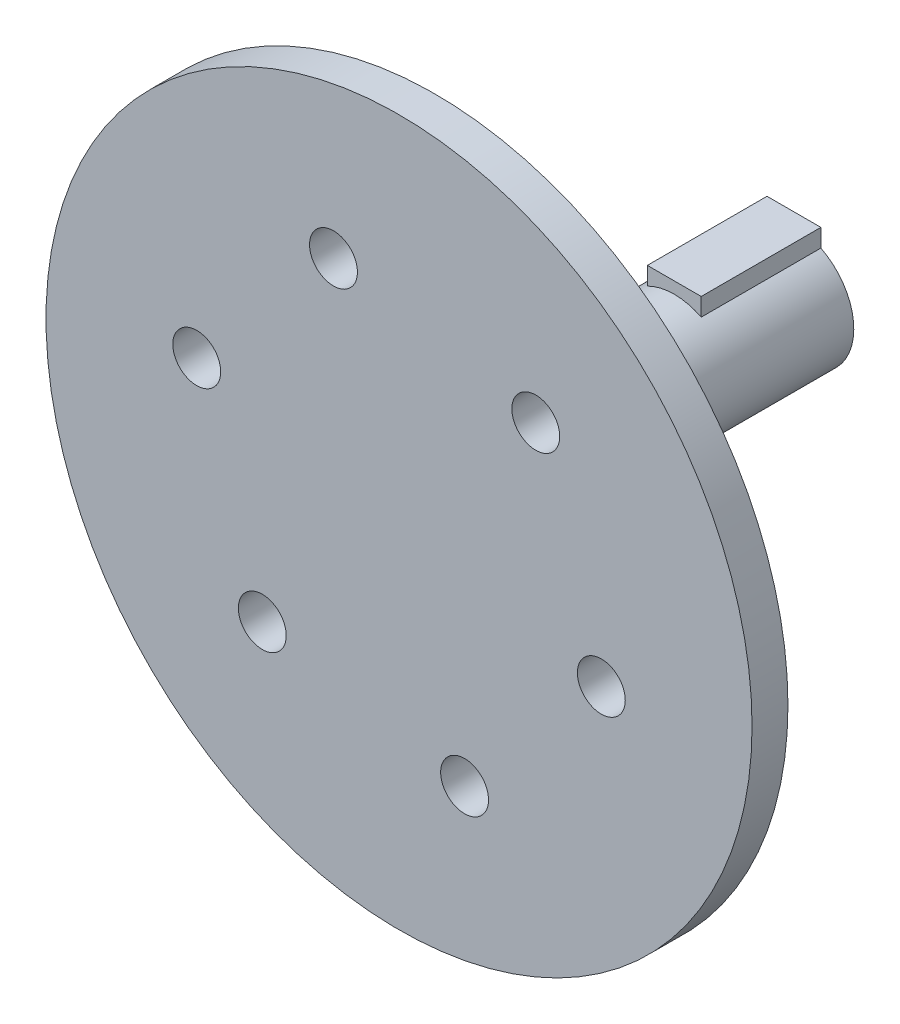
ISO-10303-21;
HEADER;
FILE_DESCRIPTION(('STEP AP214'),'2;1');
FILE_NAME('part.step','',(''),(''),'','','');
FILE_SCHEMA(('AUTOMOTIVE_DESIGN { 1 0 10303 214 1 1 1 1 }'));
ENDSEC;
DATA;
#1=APPLICATION_CONTEXT('core data for automotive mechanical design processes');
#2=APPLICATION_PROTOCOL_DEFINITION('international standard','automotive_design',2000,#1);
#3=PRODUCT_CONTEXT('',#1,'mechanical');
#4=PRODUCT('Part','Part','',(#3));
#5=PRODUCT_RELATED_PRODUCT_CATEGORY('part','',(#4));
#6=PRODUCT_DEFINITION_FORMATION('','',#4);
#7=PRODUCT_DEFINITION_CONTEXT('part definition',#1,'design');
#8=PRODUCT_DEFINITION('design','',#6,#7);
#9=PRODUCT_DEFINITION_SHAPE('','',#8);
#10=(LENGTH_UNIT() NAMED_UNIT(*) SI_UNIT(.MILLI.,.METRE.));
#11=(NAMED_UNIT(*) PLANE_ANGLE_UNIT() SI_UNIT($,.RADIAN.));
#12=(NAMED_UNIT(*) SI_UNIT($,.STERADIAN.) SOLID_ANGLE_UNIT());
#13=UNCERTAINTY_MEASURE_WITH_UNIT(LENGTH_MEASURE(1.E-05),#10,'distance_accuracy_value','');
#14=(GEOMETRIC_REPRESENTATION_CONTEXT(3) GLOBAL_UNCERTAINTY_ASSIGNED_CONTEXT((#13)) GLOBAL_UNIT_ASSIGNED_CONTEXT((#10,
#11,#12)) REPRESENTATION_CONTEXT('',''));
#15=CARTESIAN_POINT('',(0.,0.,0.));
#16=DIRECTION('',(0.,0.,1.));
#17=DIRECTION('',(1.,0.,0.));
#18=AXIS2_PLACEMENT_3D('',#15,#16,#17);
#19=CARTESIAN_POINT('',(0.,0.,10.));
#20=DIRECTION('',(0.,0.,1.));
#21=DIRECTION('',(1.,0.,0.));
#22=AXIS2_PLACEMENT_3D('',#19,#20,#21);
#23=PLANE('',#22);
#24=DIRECTION('',(0.,-1.,0.));
#25=VECTOR('',#24,1.);
#26=CARTESIAN_POINT('',(-2.25,0.,10.));
#27=LINE('',#26,#25);
#28=CARTESIAN_POINT('',(-2.25,5.96514277487294,10.));
#29=VERTEX_POINT('',#28);
#30=CARTESIAN_POINT('',(-2.25,4.46514277487294,10.));
#31=VERTEX_POINT('',#30);
#32=EDGE_CURVE('E58',#29,#31,#27,.T.);
#33=ORIENTED_EDGE('',*,*,#32,.T.);
#34=CARTESIAN_POINT('',(0.,0.,10.));
#35=DIRECTION('',(0.,0.,1.));
#36=DIRECTION('',(1.,0.,0.));
#37=AXIS2_PLACEMENT_3D('',#34,#35,#36);
#38=CIRCLE('',#37,5.);
#39=CARTESIAN_POINT('',(2.25,4.46514277487294,10.));
#40=VERTEX_POINT('',#39);
#41=EDGE_CURVE('E94',#31,#40,#38,.F.);
#42=ORIENTED_EDGE('',*,*,#41,.T.);
#43=DIRECTION('',(0.,-1.,0.));
#44=VECTOR('',#43,1.);
#45=CARTESIAN_POINT('',(2.25,0.,10.));
#46=LINE('',#45,#44);
#47=CARTESIAN_POINT('',(2.25,5.96514277487294,10.));
#48=VERTEX_POINT('',#47);
#49=EDGE_CURVE('E84',#48,#40,#46,.T.);
#50=ORIENTED_EDGE('',*,*,#49,.F.);
#51=DIRECTION('',(1.,0.,0.));
#52=VECTOR('',#51,1.);
#53=CARTESIAN_POINT('',(0.,5.96514277487294,10.));
#54=LINE('',#53,#52);
#55=EDGE_CURVE('E89',#29,#48,#54,.T.);
#56=ORIENTED_EDGE('',*,*,#55,.F.);
#57=EDGE_LOOP('',(#33,#42,#50,#56));
#58=FACE_BOUND('',#57,.T.);
#59=ADVANCED_FACE('F41',(#58),#23,.T.);
#60=CARTESIAN_POINT('',(0.,0.,10.));
#61=DIRECTION('',(0.,0.,-1.));
#62=DIRECTION('',(-1.,0.,0.));
#63=AXIS2_PLACEMENT_3D('',#60,#61,#62);
#64=CYLINDRICAL_SURFACE('',#63,5.);
#65=CARTESIAN_POINT('',(0.,0.,0.));
#66=DIRECTION('',(0.,0.,1.));
#67=DIRECTION('',(1.,0.,0.));
#68=AXIS2_PLACEMENT_3D('',#65,#66,#67);
#69=CIRCLE('',#68,5.);
#70=CARTESIAN_POINT('',(-2.25,4.46514277487294,0.));
#71=VERTEX_POINT('',#70);
#72=CARTESIAN_POINT('',(2.25,4.46514277487294,0.));
#73=VERTEX_POINT('',#72);
#74=EDGE_CURVE('E96',#71,#73,#69,.T.);
#75=ORIENTED_EDGE('',*,*,#74,.T.);
#76=DIRECTION('',(0.,0.,-1.));
#77=VECTOR('',#76,1.);
#78=CARTESIAN_POINT('',(2.25,4.46514277487294,10.));
#79=LINE('',#78,#77);
#80=EDGE_CURVE('E11',#40,#73,#79,.T.);
#81=ORIENTED_EDGE('',*,*,#80,.F.);
#82=ORIENTED_EDGE('',*,*,#41,.F.);
#83=DIRECTION('',(0.,0.,-1.));
#84=VECTOR('',#83,1.);
#85=CARTESIAN_POINT('',(-2.25,4.46514277487294,10.));
#86=LINE('',#85,#84);
#87=EDGE_CURVE('E108',#31,#71,#86,.T.);
#88=ORIENTED_EDGE('',*,*,#87,.T.);
#89=EDGE_LOOP('',(#75,#81,#82,#88));
#90=FACE_BOUND('',#89,.T.);
#91=CARTESIAN_POINT('',(0.,0.,30.));
#92=DIRECTION('',(0.,0.,1.));
#93=DIRECTION('',(1.,0.,0.));
#94=AXIS2_PLACEMENT_3D('',#91,#92,#93);
#95=CIRCLE('',#94,5.);
#96=CARTESIAN_POINT('',(5.,0.,30.));
#97=VERTEX_POINT('',#96);
#98=EDGE_CURVE('E98',#97,#97,#95,.T.);
#99=ORIENTED_EDGE('',*,*,#98,.F.);
#100=EDGE_LOOP('',(#99));
#101=FACE_BOUND('',#100,.T.);
#102=ADVANCED_FACE('F43',(#90,#101),#64,.T.);
#103=CARTESIAN_POINT('',(2.25,0.,10.));
#104=DIRECTION('',(1.,0.,0.));
#105=DIRECTION('',(0.,0.,-1.));
#106=AXIS2_PLACEMENT_3D('',#103,#104,#105);
#107=PLANE('',#106);
#108=DIRECTION('',(0.,-1.,0.));
#109=VECTOR('',#108,1.);
#110=CARTESIAN_POINT('',(2.25,0.,0.));
#111=LINE('',#110,#109);
#112=CARTESIAN_POINT('',(2.25,5.96514277487294,0.));
#113=VERTEX_POINT('',#112);
#114=EDGE_CURVE('E100',#113,#73,#111,.T.);
#115=ORIENTED_EDGE('',*,*,#114,.F.);
#116=DIRECTION('',(0.,0.,-1.));
#117=VECTOR('',#116,1.);
#118=CARTESIAN_POINT('',(2.25,5.96514277487294,10.));
#119=LINE('',#118,#117);
#120=EDGE_CURVE('E50',#48,#113,#119,.T.);
#121=ORIENTED_EDGE('',*,*,#120,.F.);
#122=ORIENTED_EDGE('',*,*,#49,.T.);
#123=ORIENTED_EDGE('',*,*,#80,.T.);
#124=EDGE_LOOP('',(#115,#121,#122,#123));
#125=FACE_BOUND('',#124,.T.);
#126=ADVANCED_FACE('F86',(#125),#107,.T.);
#127=CARTESIAN_POINT('',(0.,5.96514277487294,10.));
#128=DIRECTION('',(0.,1.,0.));
#129=DIRECTION('',(0.,0.,1.));
#130=AXIS2_PLACEMENT_3D('',#127,#128,#129);
#131=PLANE('',#130);
#132=DIRECTION('',(1.,0.,0.));
#133=VECTOR('',#132,1.);
#134=CARTESIAN_POINT('',(0.,5.96514277487294,0.));
#135=LINE('',#134,#133);
#136=CARTESIAN_POINT('',(-2.25,5.96514277487294,0.));
#137=VERTEX_POINT('',#136);
#138=EDGE_CURVE('E111',#137,#113,#135,.T.);
#139=ORIENTED_EDGE('',*,*,#138,.F.);
#140=DIRECTION('',(0.,0.,-1.));
#141=VECTOR('',#140,1.);
#142=CARTESIAN_POINT('',(-2.25,5.96514277487294,10.));
#143=LINE('',#142,#141);
#144=EDGE_CURVE('E74',#29,#137,#143,.T.);
#145=ORIENTED_EDGE('',*,*,#144,.F.);
#146=ORIENTED_EDGE('',*,*,#55,.T.);
#147=ORIENTED_EDGE('',*,*,#120,.T.);
#148=EDGE_LOOP('',(#139,#145,#146,#147));
#149=FACE_BOUND('',#148,.T.);
#150=ADVANCED_FACE('F118',(#149),#131,.T.);
#151=CARTESIAN_POINT('',(-2.25,0.,10.));
#152=DIRECTION('',(1.,0.,0.));
#153=DIRECTION('',(0.,1.,0.));
#154=AXIS2_PLACEMENT_3D('',#151,#152,#153);
#155=PLANE('',#154);
#156=DIRECTION('',(0.,-1.,0.));
#157=VECTOR('',#156,1.);
#158=CARTESIAN_POINT('',(-2.25,0.,0.));
#159=LINE('',#158,#157);
#160=EDGE_CURVE('E76',#137,#71,#159,.T.);
#161=ORIENTED_EDGE('',*,*,#160,.T.);
#162=ORIENTED_EDGE('',*,*,#87,.F.);
#163=ORIENTED_EDGE('',*,*,#32,.F.);
#164=ORIENTED_EDGE('',*,*,#144,.T.);
#165=EDGE_LOOP('',(#161,#162,#163,#164));
#166=FACE_BOUND('',#165,.T.);
#167=ADVANCED_FACE('F123',(#166),#155,.F.);
#168=CARTESIAN_POINT('',(0.,0.,0.));
#169=DIRECTION('',(0.,0.,1.));
#170=DIRECTION('',(1.,0.,0.));
#171=AXIS2_PLACEMENT_3D('',#168,#169,#170);
#172=PLANE('',#171);
#173=ORIENTED_EDGE('',*,*,#74,.F.);
#174=ORIENTED_EDGE('',*,*,#160,.F.);
#175=ORIENTED_EDGE('',*,*,#138,.T.);
#176=ORIENTED_EDGE('',*,*,#114,.T.);
#177=EDGE_LOOP('',(#173,#174,#175,#176));
#178=FACE_BOUND('',#177,.T.);
#179=ADVANCED_FACE('F120',(#178),#172,.F.);
#180=CARTESIAN_POINT('',(0.,0.,33.));
#181=DIRECTION('',(0.,0.,-1.));
#182=DIRECTION('',(-1.,0.,0.));
#183=AXIS2_PLACEMENT_3D('',#180,#181,#182);
#184=CYLINDRICAL_SURFACE('',#183,29.5);
#185=CARTESIAN_POINT('',(0.,0.,33.));
#186=DIRECTION('',(0.,0.,1.));
#187=DIRECTION('',(1.,0.,0.));
#188=AXIS2_PLACEMENT_3D('',#185,#186,#187);
#189=CIRCLE('',#188,29.5);
#190=CARTESIAN_POINT('',(29.5,0.,33.));
#191=VERTEX_POINT('',#190);
#192=EDGE_CURVE('E103',#191,#191,#189,.T.);
#193=ORIENTED_EDGE('',*,*,#192,.F.);
#194=EDGE_LOOP('',(#193));
#195=FACE_BOUND('',#194,.T.);
#196=CARTESIAN_POINT('',(0.,0.,30.));
#197=DIRECTION('',(0.,0.,1.));
#198=DIRECTION('',(1.,0.,0.));
#199=AXIS2_PLACEMENT_3D('',#196,#197,#198);
#200=CIRCLE('',#199,29.5);
#201=CARTESIAN_POINT('',(29.5,0.,30.));
#202=VERTEX_POINT('',#201);
#203=EDGE_CURVE('E212',#202,#202,#200,.T.);
#204=ORIENTED_EDGE('',*,*,#203,.T.);
#205=EDGE_LOOP('',(#204));
#206=FACE_BOUND('',#205,.T.);
#207=ADVANCED_FACE('F122',(#195,#206),#184,.T.);
#208=CARTESIAN_POINT('',(0.,0.,33.));
#209=DIRECTION('',(0.,0.,1.));
#210=DIRECTION('',(1.,0.,0.));
#211=AXIS2_PLACEMENT_3D('',#208,#209,#210);
#212=PLANE('',#211);
#213=CARTESIAN_POINT('',(-16.9046374461334,3.43449163847944,33.));
#214=DIRECTION('',(0.,0.,1.));
#215=DIRECTION('',(1.,0.,0.));
#216=AXIS2_PLACEMENT_3D('',#213,#214,#215);
#217=CIRCLE('',#216,2.);
#218=CARTESIAN_POINT('',(-14.9046374461334,3.43449163847944,33.));
#219=VERTEX_POINT('',#218);
#220=EDGE_CURVE('E205',#219,#219,#217,.T.);
#221=ORIENTED_EDGE('',*,*,#220,.F.);
#222=EDGE_LOOP('',(#221));
#223=FACE_BOUND('',#222,.T.);
#224=CARTESIAN_POINT('',(-11.4266757310751,-12.9225996508775,33.));
#225=DIRECTION('',(0.,0.,1.));
#226=DIRECTION('',(1.,0.,0.));
#227=AXIS2_PLACEMENT_3D('',#224,#225,#226);
#228=CIRCLE('',#227,2.);
#229=CARTESIAN_POINT('',(-9.4266757310751,-12.9225996508775,33.));
#230=VERTEX_POINT('',#229);
#231=EDGE_CURVE('E199',#230,#230,#228,.T.);
#232=ORIENTED_EDGE('',*,*,#231,.F.);
#233=EDGE_LOOP('',(#232));
#234=FACE_BOUND('',#233,.T.);
#235=CARTESIAN_POINT('',(5.47796171505833,-16.3570912893569,33.));
#236=DIRECTION('',(0.,0.,1.));
#237=DIRECTION('',(1.,0.,0.));
#238=AXIS2_PLACEMENT_3D('',#235,#236,#237);
#239=CIRCLE('',#238,2.);
#240=CARTESIAN_POINT('',(7.47796171505833,-16.3570912893569,33.));
#241=VERTEX_POINT('',#240);
#242=EDGE_CURVE('E193',#241,#241,#239,.T.);
#243=ORIENTED_EDGE('',*,*,#242,.F.);
#244=EDGE_LOOP('',(#243));
#245=FACE_BOUND('',#244,.T.);
#246=CARTESIAN_POINT('',(16.9046374461334,-3.43449163847932,33.));
#247=DIRECTION('',(0.,0.,1.));
#248=DIRECTION('',(1.,0.,0.));
#249=AXIS2_PLACEMENT_3D('',#246,#247,#248);
#250=CIRCLE('',#249,2.);
#251=CARTESIAN_POINT('',(18.9046374461334,-3.43449163847932,33.));
#252=VERTEX_POINT('',#251);
#253=EDGE_CURVE('E185',#252,#252,#250,.T.);
#254=ORIENTED_EDGE('',*,*,#253,.F.);
#255=EDGE_LOOP('',(#254));
#256=FACE_BOUND('',#255,.T.);
#257=CARTESIAN_POINT('',(11.426675731075,12.9225996508776,33.));
#258=DIRECTION('',(0.,0.,1.));
#259=DIRECTION('',(1.,0.,0.));
#260=AXIS2_PLACEMENT_3D('',#257,#258,#259);
#261=CIRCLE('',#260,2.);
#262=CARTESIAN_POINT('',(13.426675731075,12.9225996508776,33.));
#263=VERTEX_POINT('',#262);
#264=EDGE_CURVE('E178',#263,#263,#261,.T.);
#265=ORIENTED_EDGE('',*,*,#264,.F.);
#266=EDGE_LOOP('',(#265));
#267=FACE_BOUND('',#266,.T.);
#268=CARTESIAN_POINT('',(-5.47796171505844,16.3570912893569,33.));
#269=DIRECTION('',(0.,0.,1.));
#270=DIRECTION('',(1.,0.,0.));
#271=AXIS2_PLACEMENT_3D('',#268,#269,#270);
#272=CIRCLE('',#271,2.);
#273=CARTESIAN_POINT('',(-3.47796171505844,16.3570912893569,33.));
#274=VERTEX_POINT('',#273);
#275=EDGE_CURVE('E180',#274,#274,#272,.T.);
#276=ORIENTED_EDGE('',*,*,#275,.F.);
#277=EDGE_LOOP('',(#276));
#278=FACE_BOUND('',#277,.T.);
#279=ORIENTED_EDGE('',*,*,#192,.T.);
#280=EDGE_LOOP('',(#279));
#281=FACE_BOUND('',#280,.T.);
#282=ADVANCED_FACE('F129',(#223,#234,#245,#256,#267,#278,#281),#212,.T.);
#283=CARTESIAN_POINT('',(0.,0.,30.));
#284=DIRECTION('',(0.,0.,1.));
#285=DIRECTION('',(1.,0.,0.));
#286=AXIS2_PLACEMENT_3D('',#283,#284,#285);
#287=PLANE('',#286);
#288=CARTESIAN_POINT('',(-16.9046374461334,3.43449163847944,30.));
#289=DIRECTION('',(0.,0.,1.));
#290=DIRECTION('',(1.,0.,0.));
#291=AXIS2_PLACEMENT_3D('',#288,#289,#290);
#292=CIRCLE('',#291,2.);
#293=CARTESIAN_POINT('',(-14.9046374461334,3.43449163847944,30.));
#294=VERTEX_POINT('',#293);
#295=EDGE_CURVE('E208',#294,#294,#292,.T.);
#296=ORIENTED_EDGE('',*,*,#295,.T.);
#297=EDGE_LOOP('',(#296));
#298=FACE_BOUND('',#297,.T.);
#299=CARTESIAN_POINT('',(-11.4266757310751,-12.9225996508775,30.));
#300=DIRECTION('',(0.,0.,1.));
#301=DIRECTION('',(1.,0.,0.));
#302=AXIS2_PLACEMENT_3D('',#299,#300,#301);
#303=CIRCLE('',#302,2.);
#304=CARTESIAN_POINT('',(-9.4266757310751,-12.9225996508775,30.));
#305=VERTEX_POINT('',#304);
#306=EDGE_CURVE('E202',#305,#305,#303,.T.);
#307=ORIENTED_EDGE('',*,*,#306,.T.);
#308=EDGE_LOOP('',(#307));
#309=FACE_BOUND('',#308,.T.);
#310=CARTESIAN_POINT('',(5.47796171505833,-16.3570912893569,30.));
#311=DIRECTION('',(0.,0.,1.));
#312=DIRECTION('',(1.,0.,0.));
#313=AXIS2_PLACEMENT_3D('',#310,#311,#312);
#314=CIRCLE('',#313,2.);
#315=CARTESIAN_POINT('',(7.47796171505833,-16.3570912893569,30.));
#316=VERTEX_POINT('',#315);
#317=EDGE_CURVE('E196',#316,#316,#314,.T.);
#318=ORIENTED_EDGE('',*,*,#317,.T.);
#319=EDGE_LOOP('',(#318));
#320=FACE_BOUND('',#319,.T.);
#321=CARTESIAN_POINT('',(16.9046374461334,-3.43449163847932,30.));
#322=DIRECTION('',(0.,0.,1.));
#323=DIRECTION('',(1.,0.,0.));
#324=AXIS2_PLACEMENT_3D('',#321,#322,#323);
#325=CIRCLE('',#324,2.);
#326=CARTESIAN_POINT('',(18.9046374461334,-3.43449163847932,30.));
#327=VERTEX_POINT('',#326);
#328=EDGE_CURVE('E190',#327,#327,#325,.T.);
#329=ORIENTED_EDGE('',*,*,#328,.T.);
#330=EDGE_LOOP('',(#329));
#331=FACE_BOUND('',#330,.T.);
#332=CARTESIAN_POINT('',(11.426675731075,12.9225996508776,30.));
#333=DIRECTION('',(0.,0.,1.));
#334=DIRECTION('',(1.,0.,0.));
#335=AXIS2_PLACEMENT_3D('',#332,#333,#334);
#336=CIRCLE('',#335,2.);
#337=CARTESIAN_POINT('',(13.426675731075,12.9225996508776,30.));
#338=VERTEX_POINT('',#337);
#339=EDGE_CURVE('E175',#338,#338,#336,.T.);
#340=ORIENTED_EDGE('',*,*,#339,.T.);
#341=EDGE_LOOP('',(#340));
#342=FACE_BOUND('',#341,.T.);
#343=CARTESIAN_POINT('',(-5.47796171505844,16.3570912893569,30.));
#344=DIRECTION('',(0.,0.,1.));
#345=DIRECTION('',(1.,0.,0.));
#346=AXIS2_PLACEMENT_3D('',#343,#344,#345);
#347=CIRCLE('',#346,2.);
#348=CARTESIAN_POINT('',(-3.47796171505844,16.3570912893569,30.));
#349=VERTEX_POINT('',#348);
#350=EDGE_CURVE('E183',#349,#349,#347,.T.);
#351=ORIENTED_EDGE('',*,*,#350,.T.);
#352=EDGE_LOOP('',(#351));
#353=FACE_BOUND('',#352,.T.);
#354=ORIENTED_EDGE('',*,*,#98,.T.);
#355=EDGE_LOOP('',(#354));
#356=FACE_BOUND('',#355,.T.);
#357=ORIENTED_EDGE('',*,*,#203,.F.);
#358=EDGE_LOOP('',(#357));
#359=FACE_BOUND('',#358,.T.);
#360=ADVANCED_FACE('F140',(#298,#309,#320,#331,#342,#353,#356,#359),#287,.F.);
#361=CARTESIAN_POINT('',(-5.47796171505844,16.3570912893569,30.));
#362=DIRECTION('',(0.,0.,1.));
#363=DIRECTION('',(1.,0.,0.));
#364=AXIS2_PLACEMENT_3D('',#361,#362,#363);
#365=CYLINDRICAL_SURFACE('',#364,2.);
#366=ORIENTED_EDGE('',*,*,#350,.F.);
#367=EDGE_LOOP('',(#366));
#368=FACE_BOUND('',#367,.T.);
#369=ORIENTED_EDGE('',*,*,#275,.T.);
#370=EDGE_LOOP('',(#369));
#371=FACE_BOUND('',#370,.T.);
#372=ADVANCED_FACE('F143',(#368,#371),#365,.F.);
#373=CARTESIAN_POINT('',(11.426675731075,12.9225996508776,30.));
#374=DIRECTION('',(0.,0.,1.));
#375=DIRECTION('',(1.,0.,0.));
#376=AXIS2_PLACEMENT_3D('',#373,#374,#375);
#377=CYLINDRICAL_SURFACE('',#376,2.);
#378=ORIENTED_EDGE('',*,*,#339,.F.);
#379=EDGE_LOOP('',(#378));
#380=FACE_BOUND('',#379,.T.);
#381=ORIENTED_EDGE('',*,*,#264,.T.);
#382=EDGE_LOOP('',(#381));
#383=FACE_BOUND('',#382,.T.);
#384=ADVANCED_FACE('F150',(#380,#383),#377,.F.);
#385=CARTESIAN_POINT('',(16.9046374461334,-3.43449163847932,30.));
#386=DIRECTION('',(0.,0.,1.));
#387=DIRECTION('',(1.,0.,0.));
#388=AXIS2_PLACEMENT_3D('',#385,#386,#387);
#389=CYLINDRICAL_SURFACE('',#388,2.);
#390=ORIENTED_EDGE('',*,*,#328,.F.);
#391=EDGE_LOOP('',(#390));
#392=FACE_BOUND('',#391,.T.);
#393=ORIENTED_EDGE('',*,*,#253,.T.);
#394=EDGE_LOOP('',(#393));
#395=FACE_BOUND('',#394,.T.);
#396=ADVANCED_FACE('F163',(#392,#395),#389,.F.);
#397=CARTESIAN_POINT('',(5.47796171505833,-16.3570912893569,30.));
#398=DIRECTION('',(0.,0.,1.));
#399=DIRECTION('',(1.,0.,0.));
#400=AXIS2_PLACEMENT_3D('',#397,#398,#399);
#401=CYLINDRICAL_SURFACE('',#400,2.);
#402=ORIENTED_EDGE('',*,*,#317,.F.);
#403=EDGE_LOOP('',(#402));
#404=FACE_BOUND('',#403,.T.);
#405=ORIENTED_EDGE('',*,*,#242,.T.);
#406=EDGE_LOOP('',(#405));
#407=FACE_BOUND('',#406,.T.);
#408=ADVANCED_FACE('F159',(#404,#407),#401,.F.);
#409=CARTESIAN_POINT('',(-11.4266757310751,-12.9225996508775,30.));
#410=DIRECTION('',(0.,0.,1.));
#411=DIRECTION('',(1.,0.,0.));
#412=AXIS2_PLACEMENT_3D('',#409,#410,#411);
#413=CYLINDRICAL_SURFACE('',#412,2.);
#414=ORIENTED_EDGE('',*,*,#306,.F.);
#415=EDGE_LOOP('',(#414));
#416=FACE_BOUND('',#415,.T.);
#417=ORIENTED_EDGE('',*,*,#231,.T.);
#418=EDGE_LOOP('',(#417));
#419=FACE_BOUND('',#418,.T.);
#420=ADVANCED_FACE('F155',(#416,#419),#413,.F.);
#421=CARTESIAN_POINT('',(-16.9046374461334,3.43449163847944,30.));
#422=DIRECTION('',(0.,0.,1.));
#423=DIRECTION('',(1.,0.,0.));
#424=AXIS2_PLACEMENT_3D('',#421,#422,#423);
#425=CYLINDRICAL_SURFACE('',#424,2.);
#426=ORIENTED_EDGE('',*,*,#295,.F.);
#427=EDGE_LOOP('',(#426));
#428=FACE_BOUND('',#427,.T.);
#429=ORIENTED_EDGE('',*,*,#220,.T.);
#430=EDGE_LOOP('',(#429));
#431=FACE_BOUND('',#430,.T.);
#432=ADVANCED_FACE('F152',(#428,#431),#425,.F.);
#433=CLOSED_SHELL('',(#59,#102,#126,#150,#167,#179,#207,#282,#360,#372,#384,#396,#408,#420,#432));
#434=MANIFOLD_SOLID_BREP('B2',#433);
#435=ADVANCED_BREP_SHAPE_REPRESENTATION('',(#18,#434),#14);
#436=SHAPE_DEFINITION_REPRESENTATION(#9,#435);
ENDSEC;
END-ISO-10303-21;
